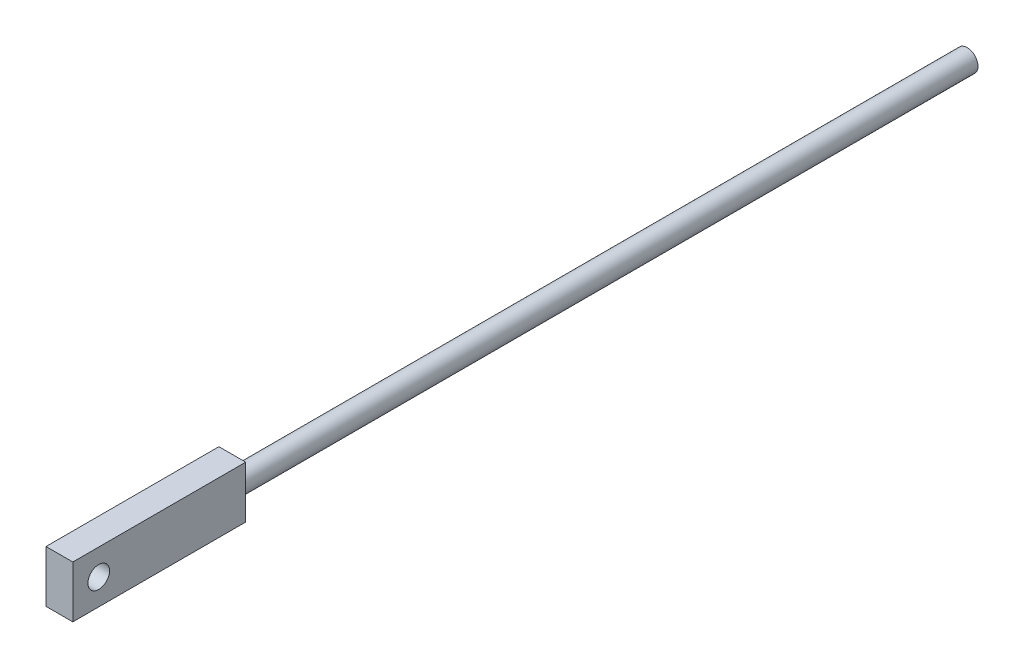
ISO-10303-21;
HEADER;
FILE_DESCRIPTION(('STEP AP214'),'2;1');
FILE_NAME('part.step','',(''),(''),'','','');
FILE_SCHEMA(('AUTOMOTIVE_DESIGN { 1 0 10303 214 1 1 1 1 }'));
ENDSEC;
DATA;
#1=APPLICATION_CONTEXT('core data for automotive mechanical design processes');
#2=APPLICATION_PROTOCOL_DEFINITION('international standard','automotive_design',2000,#1);
#3=PRODUCT_CONTEXT('',#1,'mechanical');
#4=PRODUCT('Part','Part','',(#3));
#5=PRODUCT_RELATED_PRODUCT_CATEGORY('part','',(#4));
#6=PRODUCT_DEFINITION_FORMATION('','',#4);
#7=PRODUCT_DEFINITION_CONTEXT('part definition',#1,'design');
#8=PRODUCT_DEFINITION('design','',#6,#7);
#9=PRODUCT_DEFINITION_SHAPE('','',#8);
#10=(LENGTH_UNIT() NAMED_UNIT(*) SI_UNIT(.MILLI.,.METRE.));
#11=(NAMED_UNIT(*) PLANE_ANGLE_UNIT() SI_UNIT($,.RADIAN.));
#12=(NAMED_UNIT(*) SI_UNIT($,.STERADIAN.) SOLID_ANGLE_UNIT());
#13=UNCERTAINTY_MEASURE_WITH_UNIT(LENGTH_MEASURE(1.E-05),#10,'distance_accuracy_value','');
#14=(GEOMETRIC_REPRESENTATION_CONTEXT(3) GLOBAL_UNCERTAINTY_ASSIGNED_CONTEXT((#13)) GLOBAL_UNIT_ASSIGNED_CONTEXT((#10,
#11,#12)) REPRESENTATION_CONTEXT('',''));
#15=CARTESIAN_POINT('',(0.,0.,0.));
#16=DIRECTION('',(0.,0.,1.));
#17=DIRECTION('',(1.,0.,0.));
#18=AXIS2_PLACEMENT_3D('',#15,#16,#17);
#19=CARTESIAN_POINT('',(3.1,-6.,40.));
#20=DIRECTION('',(-1.,0.,0.));
#21=DIRECTION('',(0.,0.,1.));
#22=AXIS2_PLACEMENT_3D('',#19,#20,#21);
#23=PLANE('',#22);
#24=CARTESIAN_POINT('',(3.1,0.,34.));
#25=DIRECTION('',(1.,0.,0.));
#26=DIRECTION('',(0.,0.,-1.));
#27=AXIS2_PLACEMENT_3D('',#24,#25,#26);
#28=CIRCLE('',#27,2.5);
#29=CARTESIAN_POINT('',(3.1,0.,31.5));
#30=VERTEX_POINT('',#29);
#31=EDGE_CURVE('E137',#30,#30,#28,.T.);
#32=ORIENTED_EDGE('',*,*,#31,.F.);
#33=EDGE_LOOP('',(#32));
#34=FACE_BOUND('',#33,.T.);
#35=DIRECTION('',(0.,1.,0.));
#36=VECTOR('',#35,1.);
#37=CARTESIAN_POINT('',(3.1,-6.,0.));
#38=LINE('',#37,#36);
#39=CARTESIAN_POINT('',(3.1,-6.,0.));
#40=VERTEX_POINT('',#39);
#41=CARTESIAN_POINT('',(3.1,6.,0.));
#42=VERTEX_POINT('',#41);
#43=EDGE_CURVE('E116',#40,#42,#38,.T.);
#44=ORIENTED_EDGE('',*,*,#43,.T.);
#45=DIRECTION('',(0.,0.,-1.));
#46=VECTOR('',#45,1.);
#47=CARTESIAN_POINT('',(3.1,6.,40.));
#48=LINE('',#47,#46);
#49=CARTESIAN_POINT('',(3.1,6.,40.));
#50=VERTEX_POINT('',#49);
#51=EDGE_CURVE('E48',#50,#42,#48,.T.);
#52=ORIENTED_EDGE('',*,*,#51,.F.);
#53=DIRECTION('',(0.,1.,0.));
#54=VECTOR('',#53,1.);
#55=CARTESIAN_POINT('',(3.1,-6.,40.));
#56=LINE('',#55,#54);
#57=CARTESIAN_POINT('',(3.1,-6.,40.));
#58=VERTEX_POINT('',#57);
#59=EDGE_CURVE('E99',#58,#50,#56,.T.);
#60=ORIENTED_EDGE('',*,*,#59,.F.);
#61=DIRECTION('',(0.,0.,-1.));
#62=VECTOR('',#61,1.);
#63=CARTESIAN_POINT('',(3.1,-6.,40.));
#64=LINE('',#63,#62);
#65=EDGE_CURVE('E112',#58,#40,#64,.T.);
#66=ORIENTED_EDGE('',*,*,#65,.T.);
#67=EDGE_LOOP('',(#44,#52,#60,#66));
#68=FACE_BOUND('',#67,.T.);
#69=ADVANCED_FACE('F45',(#34,#68),#23,.F.);
#70=CARTESIAN_POINT('',(-3.1,6.,40.));
#71=DIRECTION('',(0.,-1.,0.));
#72=DIRECTION('',(0.,0.,-1.));
#73=AXIS2_PLACEMENT_3D('',#70,#71,#72);
#74=PLANE('',#73);
#75=DIRECTION('',(-1.,0.,0.));
#76=VECTOR('',#75,1.);
#77=CARTESIAN_POINT('',(-3.1,6.,0.));
#78=LINE('',#77,#76);
#79=CARTESIAN_POINT('',(-3.1,6.,0.));
#80=VERTEX_POINT('',#79);
#81=EDGE_CURVE('E105',#42,#80,#78,.T.);
#82=ORIENTED_EDGE('',*,*,#81,.T.);
#83=DIRECTION('',(0.,0.,-1.));
#84=VECTOR('',#83,1.);
#85=CARTESIAN_POINT('',(-3.1,6.,40.));
#86=LINE('',#85,#84);
#87=CARTESIAN_POINT('',(-3.1,6.,40.));
#88=VERTEX_POINT('',#87);
#89=EDGE_CURVE('E103',#88,#80,#86,.T.);
#90=ORIENTED_EDGE('',*,*,#89,.F.);
#91=DIRECTION('',(-1.,0.,0.));
#92=VECTOR('',#91,1.);
#93=CARTESIAN_POINT('',(-3.1,6.,40.));
#94=LINE('',#93,#92);
#95=EDGE_CURVE('E94',#50,#88,#94,.T.);
#96=ORIENTED_EDGE('',*,*,#95,.F.);
#97=ORIENTED_EDGE('',*,*,#51,.T.);
#98=EDGE_LOOP('',(#82,#90,#96,#97));
#99=FACE_BOUND('',#98,.T.);
#100=ADVANCED_FACE('F104',(#99),#74,.F.);
#101=CARTESIAN_POINT('',(-3.1,-6.,40.));
#102=DIRECTION('',(1.,0.,0.));
#103=DIRECTION('',(0.,0.,-1.));
#104=AXIS2_PLACEMENT_3D('',#101,#102,#103);
#105=PLANE('',#104);
#106=CARTESIAN_POINT('',(-3.1,0.,34.));
#107=DIRECTION('',(1.,0.,0.));
#108=DIRECTION('',(0.,0.,-1.));
#109=AXIS2_PLACEMENT_3D('',#106,#107,#108);
#110=CIRCLE('',#109,2.5);
#111=CARTESIAN_POINT('',(-3.1,0.,31.5));
#112=VERTEX_POINT('',#111);
#113=EDGE_CURVE('E120',#112,#112,#110,.T.);
#114=ORIENTED_EDGE('',*,*,#113,.T.);
#115=EDGE_LOOP('',(#114));
#116=FACE_BOUND('',#115,.T.);
#117=DIRECTION('',(0.,-1.,0.));
#118=VECTOR('',#117,1.);
#119=CARTESIAN_POINT('',(-3.1,-6.,0.));
#120=LINE('',#119,#118);
#121=CARTESIAN_POINT('',(-3.1,-6.,0.));
#122=VERTEX_POINT('',#121);
#123=EDGE_CURVE('E80',#80,#122,#120,.T.);
#124=ORIENTED_EDGE('',*,*,#123,.T.);
#125=DIRECTION('',(0.,0.,-1.));
#126=VECTOR('',#125,1.);
#127=CARTESIAN_POINT('',(-3.1,-6.,40.));
#128=LINE('',#127,#126);
#129=CARTESIAN_POINT('',(-3.1,-6.,40.));
#130=VERTEX_POINT('',#129);
#131=EDGE_CURVE('E107',#130,#122,#128,.T.);
#132=ORIENTED_EDGE('',*,*,#131,.F.);
#133=DIRECTION('',(0.,-1.,0.));
#134=VECTOR('',#133,1.);
#135=CARTESIAN_POINT('',(-3.1,-6.,40.));
#136=LINE('',#135,#134);
#137=EDGE_CURVE('E97',#88,#130,#136,.T.);
#138=ORIENTED_EDGE('',*,*,#137,.F.);
#139=ORIENTED_EDGE('',*,*,#89,.T.);
#140=EDGE_LOOP('',(#124,#132,#138,#139));
#141=FACE_BOUND('',#140,.T.);
#142=ADVANCED_FACE('F108',(#116,#141),#105,.F.);
#143=CARTESIAN_POINT('',(-3.1,-6.,40.));
#144=DIRECTION('',(0.,1.,0.));
#145=DIRECTION('',(0.,0.,1.));
#146=AXIS2_PLACEMENT_3D('',#143,#144,#145);
#147=PLANE('',#146);
#148=DIRECTION('',(1.,0.,0.));
#149=VECTOR('',#148,1.);
#150=CARTESIAN_POINT('',(-3.1,-6.,0.));
#151=LINE('',#150,#149);
#152=EDGE_CURVE('E86',#122,#40,#151,.T.);
#153=ORIENTED_EDGE('',*,*,#152,.T.);
#154=ORIENTED_EDGE('',*,*,#65,.F.);
#155=DIRECTION('',(1.,0.,0.));
#156=VECTOR('',#155,1.);
#157=CARTESIAN_POINT('',(-3.1,-6.,40.));
#158=LINE('',#157,#156);
#159=EDGE_CURVE('E63',#130,#58,#158,.T.);
#160=ORIENTED_EDGE('',*,*,#159,.F.);
#161=ORIENTED_EDGE('',*,*,#131,.T.);
#162=EDGE_LOOP('',(#153,#154,#160,#161));
#163=FACE_BOUND('',#162,.T.);
#164=ADVANCED_FACE('F130',(#163),#147,.F.);
#165=CARTESIAN_POINT('',(0.,0.,40.));
#166=DIRECTION('',(0.,0.,-1.));
#167=DIRECTION('',(-1.,0.,0.));
#168=AXIS2_PLACEMENT_3D('',#165,#166,#167);
#169=PLANE('',#168);
#170=ORIENTED_EDGE('',*,*,#59,.T.);
#171=ORIENTED_EDGE('',*,*,#95,.T.);
#172=ORIENTED_EDGE('',*,*,#137,.T.);
#173=ORIENTED_EDGE('',*,*,#159,.T.);
#174=EDGE_LOOP('',(#170,#171,#172,#173));
#175=FACE_BOUND('',#174,.T.);
#176=ADVANCED_FACE('F95',(#175),#169,.F.);
#177=CARTESIAN_POINT('',(0.,0.,0.));
#178=DIRECTION('',(0.,0.,-1.));
#179=DIRECTION('',(-1.,0.,0.));
#180=AXIS2_PLACEMENT_3D('',#177,#178,#179);
#181=PLANE('',#180);
#182=CARTESIAN_POINT('',(0.,0.,0.));
#183=DIRECTION('',(0.,0.,-1.));
#184=DIRECTION('',(-1.,0.,0.));
#185=AXIS2_PLACEMENT_3D('',#182,#183,#184);
#186=CIRCLE('',#185,2.5);
#187=CARTESIAN_POINT('',(-2.5,0.,0.));
#188=VERTEX_POINT('',#187);
#189=EDGE_CURVE('E11',#188,#188,#186,.T.);
#190=ORIENTED_EDGE('',*,*,#189,.F.);
#191=EDGE_LOOP('',(#190));
#192=FACE_BOUND('',#191,.T.);
#193=ORIENTED_EDGE('',*,*,#43,.F.);
#194=ORIENTED_EDGE('',*,*,#152,.F.);
#195=ORIENTED_EDGE('',*,*,#123,.F.);
#196=ORIENTED_EDGE('',*,*,#81,.F.);
#197=EDGE_LOOP('',(#193,#194,#195,#196));
#198=FACE_BOUND('',#197,.T.);
#199=ADVANCED_FACE('F133',(#192,#198),#181,.T.);
#200=CARTESIAN_POINT('',(-3.1,0.,34.));
#201=DIRECTION('',(1.,0.,0.));
#202=DIRECTION('',(0.,0.,-1.));
#203=AXIS2_PLACEMENT_3D('',#200,#201,#202);
#204=CYLINDRICAL_SURFACE('',#203,2.5);
#205=CARTESIAN_POINT('',(-3.1,0.,31.5));
#206=CARTESIAN_POINT('',(-3.03541666666667,0.,31.5));
#207=CARTESIAN_POINT('',(-2.97083333333333,0.,31.5));
#208=CARTESIAN_POINT('',(-2.84166666666667,0.,31.5));
#209=CARTESIAN_POINT('',(-2.77708333333333,0.,31.5));
#210=CARTESIAN_POINT('',(-2.64791666666667,0.,31.5));
#211=CARTESIAN_POINT('',(-2.58333333333333,0.,31.5));
#212=CARTESIAN_POINT('',(-2.45416666666667,0.,31.5));
#213=CARTESIAN_POINT('',(-2.38958333333333,0.,31.5));
#214=CARTESIAN_POINT('',(-2.26041666666667,0.,31.5));
#215=CARTESIAN_POINT('',(-2.19583333333333,0.,31.5));
#216=CARTESIAN_POINT('',(-2.06666666666667,0.,31.5));
#217=CARTESIAN_POINT('',(-2.00208333333333,0.,31.5));
#218=CARTESIAN_POINT('',(-1.87291666666667,0.,31.5));
#219=CARTESIAN_POINT('',(-1.80833333333333,0.,31.5));
#220=CARTESIAN_POINT('',(-1.67916666666667,0.,31.5));
#221=CARTESIAN_POINT('',(-1.61458333333333,0.,31.5));
#222=CARTESIAN_POINT('',(-1.48541666666667,0.,31.5));
#223=CARTESIAN_POINT('',(-1.42083333333333,0.,31.5));
#224=CARTESIAN_POINT('',(-1.29166666666667,0.,31.5));
#225=CARTESIAN_POINT('',(-1.22708333333333,0.,31.5));
#226=CARTESIAN_POINT('',(-1.09791666666667,0.,31.5));
#227=CARTESIAN_POINT('',(-1.03333333333333,0.,31.5));
#228=CARTESIAN_POINT('',(-0.904166666666667,0.,31.5));
#229=CARTESIAN_POINT('',(-0.839583333333333,0.,31.5));
#230=CARTESIAN_POINT('',(-0.710416666666667,0.,31.5));
#231=CARTESIAN_POINT('',(-0.645833333333333,0.,31.5));
#232=CARTESIAN_POINT('',(-0.516666666666667,0.,31.5));
#233=CARTESIAN_POINT('',(-0.452083333333333,0.,31.5));
#234=CARTESIAN_POINT('',(-0.322916666666667,0.,31.5));
#235=CARTESIAN_POINT('',(-0.258333333333333,0.,31.5));
#236=CARTESIAN_POINT('',(-0.129166666666667,0.,31.5));
#237=CARTESIAN_POINT('',(-0.0645833333333333,0.,31.5));
#238=CARTESIAN_POINT('',(0.0645833333333333,0.,31.5));
#239=CARTESIAN_POINT('',(0.129166666666667,0.,31.5));
#240=CARTESIAN_POINT('',(0.258333333333333,0.,31.5));
#241=CARTESIAN_POINT('',(0.322916666666667,0.,31.5));
#242=CARTESIAN_POINT('',(0.452083333333333,0.,31.5));
#243=CARTESIAN_POINT('',(0.516666666666667,0.,31.5));
#244=CARTESIAN_POINT('',(0.645833333333333,0.,31.5));
#245=CARTESIAN_POINT('',(0.710416666666667,0.,31.5));
#246=CARTESIAN_POINT('',(0.839583333333333,0.,31.5));
#247=CARTESIAN_POINT('',(0.904166666666666,0.,31.5));
#248=CARTESIAN_POINT('',(1.03333333333333,0.,31.5));
#249=CARTESIAN_POINT('',(1.09791666666667,0.,31.5));
#250=CARTESIAN_POINT('',(1.22708333333333,0.,31.5));
#251=CARTESIAN_POINT('',(1.29166666666667,0.,31.5));
#252=CARTESIAN_POINT('',(1.42083333333333,0.,31.5));
#253=CARTESIAN_POINT('',(1.48541666666667,0.,31.5));
#254=CARTESIAN_POINT('',(1.61458333333333,0.,31.5));
#255=CARTESIAN_POINT('',(1.67916666666667,0.,31.5));
#256=CARTESIAN_POINT('',(1.80833333333333,0.,31.5));
#257=CARTESIAN_POINT('',(1.87291666666667,0.,31.5));
#258=CARTESIAN_POINT('',(2.00208333333333,0.,31.5));
#259=CARTESIAN_POINT('',(2.06666666666667,0.,31.5));
#260=CARTESIAN_POINT('',(2.19583333333333,0.,31.5));
#261=CARTESIAN_POINT('',(2.26041666666667,0.,31.5));
#262=CARTESIAN_POINT('',(2.38958333333333,0.,31.5));
#263=CARTESIAN_POINT('',(2.45416666666667,0.,31.5));
#264=CARTESIAN_POINT('',(2.58333333333333,0.,31.5));
#265=CARTESIAN_POINT('',(2.64791666666667,0.,31.5));
#266=CARTESIAN_POINT('',(2.77708333333333,0.,31.5));
#267=CARTESIAN_POINT('',(2.84166666666667,0.,31.5));
#268=CARTESIAN_POINT('',(2.97083333333333,0.,31.5));
#269=CARTESIAN_POINT('',(3.03541666666667,0.,31.5));
#270=CARTESIAN_POINT('',(3.1,0.,31.5));
#271=B_SPLINE_CURVE_WITH_KNOTS('',3,(#205,#206,#207,#208,#209,#210,#211,#212,#213,#214,#215,
#216,#217,#218,#219,#220,#221,#222,#223,#224,#225,#226,#227,#228,#229,#230,#231,#232,#233,#234,
#235,#236,#237,#238,#239,#240,#241,#242,#243,#244,#245,#246,#247,#248,#249,#250,#251,#252,#253,
#254,#255,#256,#257,#258,#259,#260,#261,#262,#263,#264,#265,#266,#267,#268,#269,#270),
.UNSPECIFIED.,.F.,.F.,(4,2,2,2,2,2,2,2,2,2,2,2,2,2,2,2,2,2,2,2,2,2,2,2,2,2,2,2,2,2,2,2,4),(0.,
0.19375,0.3875,0.58125,0.775,0.96875,1.1625,1.35625,1.55,1.74375,1.9375,2.13125,2.325,2.51875,
2.7125,2.90625,3.1,3.29375,3.4875,3.68125,3.875,4.06875,4.2625,4.45625,4.65,4.84375,5.0375,
5.23125,5.425,5.61875,5.8125,6.00625,6.2),.UNSPECIFIED.);
#272=EDGE_CURVE('BSEAM154',#112,#30,#271,.T.);
#273=ORIENTED_EDGE('',*,*,#113,.F.);
#274=ORIENTED_EDGE('',*,*,#31,.T.);
#275=ORIENTED_EDGE('',*,*,#272,.T.);
#276=ORIENTED_EDGE('',*,*,#272,.F.);
#277=EDGE_LOOP('',(#273,#275,#274,#276));
#278=FACE_BOUND('',#277,.T.);
#279=ADVANCED_FACE('F154',(#278),#204,.F.);
#280=CARTESIAN_POINT('',(0.,0.,-170.));
#281=DIRECTION('',(0.,0.,1.));
#282=DIRECTION('',(1.,0.,0.));
#283=AXIS2_PLACEMENT_3D('',#280,#281,#282);
#284=CYLINDRICAL_SURFACE('',#283,2.5);
#285=CARTESIAN_POINT('',(0.,0.,-170.));
#286=DIRECTION('',(0.,0.,-1.));
#287=DIRECTION('',(-1.,0.,0.));
#288=AXIS2_PLACEMENT_3D('',#285,#286,#287);
#289=CIRCLE('',#288,2.5);
#290=CARTESIAN_POINT('',(-2.5,0.,-170.));
#291=VERTEX_POINT('',#290);
#292=EDGE_CURVE('E141',#291,#291,#289,.T.);
#293=ORIENTED_EDGE('',*,*,#292,.F.);
#294=EDGE_LOOP('',(#293));
#295=FACE_BOUND('',#294,.T.);
#296=ORIENTED_EDGE('',*,*,#189,.T.);
#297=EDGE_LOOP('',(#296));
#298=FACE_BOUND('',#297,.T.);
#299=ADVANCED_FACE('F151',(#295,#298),#284,.T.);
#300=CARTESIAN_POINT('',(0.,0.,-170.));
#301=DIRECTION('',(0.,0.,-1.));
#302=DIRECTION('',(-1.,0.,0.));
#303=AXIS2_PLACEMENT_3D('',#300,#301,#302);
#304=PLANE('',#303);
#305=ORIENTED_EDGE('',*,*,#292,.T.);
#306=EDGE_LOOP('',(#305));
#307=FACE_BOUND('',#306,.T.);
#308=ADVANCED_FACE('F149',(#307),#304,.T.);
#309=CLOSED_SHELL('',(#69,#100,#142,#164,#176,#199,#279,#299,#308));
#310=MANIFOLD_SOLID_BREP('B2',#309);
#311=ADVANCED_BREP_SHAPE_REPRESENTATION('',(#18,#310),#14);
#312=SHAPE_DEFINITION_REPRESENTATION(#9,#311);
ENDSEC;
END-ISO-10303-21;
